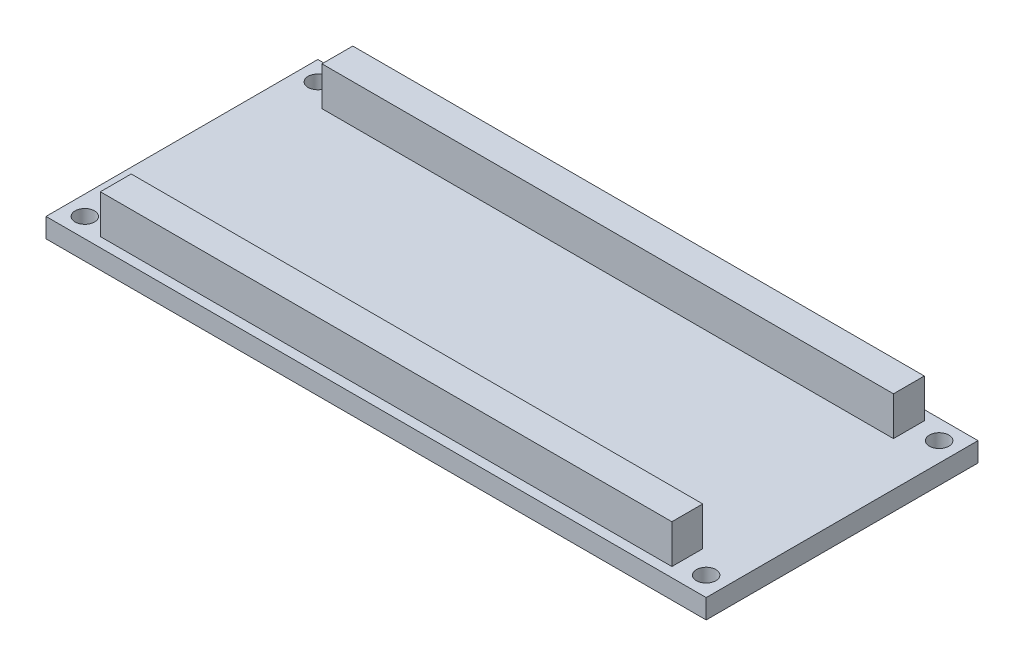
ISO-10303-21;
HEADER;
FILE_DESCRIPTION(('STEP AP214'),'2;1');
FILE_NAME('part.step','',(''),(''),'','','');
FILE_SCHEMA(('AUTOMOTIVE_DESIGN { 1 0 10303 214 1 1 1 1 }'));
ENDSEC;
DATA;
#1=APPLICATION_CONTEXT('core data for automotive mechanical design processes');
#2=APPLICATION_PROTOCOL_DEFINITION('international standard','automotive_design',2000,#1);
#3=PRODUCT_CONTEXT('',#1,'mechanical');
#4=PRODUCT('Part','Part','',(#3));
#5=PRODUCT_RELATED_PRODUCT_CATEGORY('part','',(#4));
#6=PRODUCT_DEFINITION_FORMATION('','',#4);
#7=PRODUCT_DEFINITION_CONTEXT('part definition',#1,'design');
#8=PRODUCT_DEFINITION('design','',#6,#7);
#9=PRODUCT_DEFINITION_SHAPE('','',#8);
#10=(LENGTH_UNIT() NAMED_UNIT(*) SI_UNIT(.MILLI.,.METRE.));
#11=(NAMED_UNIT(*) PLANE_ANGLE_UNIT() SI_UNIT($,.RADIAN.));
#12=(NAMED_UNIT(*) SI_UNIT($,.STERADIAN.) SOLID_ANGLE_UNIT());
#13=UNCERTAINTY_MEASURE_WITH_UNIT(LENGTH_MEASURE(1.E-05),#10,'distance_accuracy_value','');
#14=(GEOMETRIC_REPRESENTATION_CONTEXT(3) GLOBAL_UNCERTAINTY_ASSIGNED_CONTEXT((#13)) GLOBAL_UNIT_ASSIGNED_CONTEXT((#10,
#11,#12)) REPRESENTATION_CONTEXT('',''));
#15=CARTESIAN_POINT('',(0.,0.,0.));
#16=DIRECTION('',(0.,0.,1.));
#17=DIRECTION('',(1.,0.,0.));
#18=AXIS2_PLACEMENT_3D('',#15,#16,#17);
#19=CARTESIAN_POINT('',(0.,1.27,0.));
#20=DIRECTION('',(0.,-1.,0.));
#21=DIRECTION('',(0.,0.,-1.));
#22=AXIS2_PLACEMENT_3D('',#19,#20,#21);
#23=PLANE('',#22);
#24=DIRECTION('',(-1.,0.,0.));
#25=VECTOR('',#24,1.);
#26=CARTESIAN_POINT('',(-18.6685887958765,1.27,-6.23826268746161));
#27=LINE('',#26,#25);
#28=CARTESIAN_POINT('',(18.7125148871609,1.27,-6.23826268746161));
#29=VERTEX_POINT('',#28);
#30=CARTESIAN_POINT('',(-18.6685887958765,1.27,-6.23826268746161));
#31=VERTEX_POINT('',#30);
#32=EDGE_CURVE('E170',#29,#31,#27,.T.);
#33=ORIENTED_EDGE('',*,*,#32,.T.);
#34=DIRECTION('',(0.,0.,-1.));
#35=VECTOR('',#34,1.);
#36=CARTESIAN_POINT('',(-18.6685887958765,1.27,-8.255));
#37=LINE('',#36,#35);
#38=CARTESIAN_POINT('',(-18.6685887958765,1.27,-8.255));
#39=VERTEX_POINT('',#38);
#40=EDGE_CURVE('E144',#31,#39,#37,.T.);
#41=ORIENTED_EDGE('',*,*,#40,.T.);
#42=DIRECTION('',(1.,0.,0.));
#43=VECTOR('',#42,1.);
#44=CARTESIAN_POINT('',(-18.6685887958765,1.27,-8.255));
#45=LINE('',#44,#43);
#46=CARTESIAN_POINT('',(18.7125148871609,1.27,-8.255));
#47=VERTEX_POINT('',#46);
#48=EDGE_CURVE('E160',#39,#47,#45,.T.);
#49=ORIENTED_EDGE('',*,*,#48,.T.);
#50=DIRECTION('',(0.,0.,1.));
#51=VECTOR('',#50,1.);
#52=CARTESIAN_POINT('',(18.7125148871609,1.27,-8.255));
#53=LINE('',#52,#51);
#54=EDGE_CURVE('E64',#47,#29,#53,.T.);
#55=ORIENTED_EDGE('',*,*,#54,.T.);
#56=EDGE_LOOP('',(#33,#41,#49,#55));
#57=FACE_BOUND('',#56,.T.);
#58=DIRECTION('',(0.,0.,-1.));
#59=VECTOR('',#58,1.);
#60=CARTESIAN_POINT('',(21.59,1.27,8.89));
#61=LINE('',#60,#59);
#62=CARTESIAN_POINT('',(21.59,1.27,8.89));
#63=VERTEX_POINT('',#62);
#64=CARTESIAN_POINT('',(21.59,1.27,-8.89));
#65=VERTEX_POINT('',#64);
#66=EDGE_CURVE('E233',#63,#65,#61,.T.);
#67=ORIENTED_EDGE('',*,*,#66,.T.);
#68=DIRECTION('',(-1.,0.,0.));
#69=VECTOR('',#68,1.);
#70=CARTESIAN_POINT('',(-21.59,1.27,-8.89));
#71=LINE('',#70,#69);
#72=CARTESIAN_POINT('',(-21.59,1.27,-8.89));
#73=VERTEX_POINT('',#72);
#74=EDGE_CURVE('E236',#65,#73,#71,.T.);
#75=ORIENTED_EDGE('',*,*,#74,.T.);
#76=DIRECTION('',(0.,0.,1.));
#77=VECTOR('',#76,1.);
#78=CARTESIAN_POINT('',(-21.59,1.27,8.89));
#79=LINE('',#78,#77);
#80=CARTESIAN_POINT('',(-21.59,1.27,8.89));
#81=VERTEX_POINT('',#80);
#82=EDGE_CURVE('E239',#73,#81,#79,.T.);
#83=ORIENTED_EDGE('',*,*,#82,.T.);
#84=DIRECTION('',(1.,0.,0.));
#85=VECTOR('',#84,1.);
#86=CARTESIAN_POINT('',(-21.59,1.27,8.89));
#87=LINE('',#86,#85);
#88=EDGE_CURVE('E241',#81,#63,#87,.T.);
#89=ORIENTED_EDGE('',*,*,#88,.T.);
#90=EDGE_LOOP('',(#67,#75,#83,#89));
#91=FACE_BOUND('',#90,.T.);
#92=CARTESIAN_POINT('',(-20.32,1.27,-7.62));
#93=DIRECTION('',(0.,-1.,0.));
#94=DIRECTION('',(0.,0.,-1.));
#95=AXIS2_PLACEMENT_3D('',#92,#93,#94);
#96=CIRCLE('',#95,0.634999999999999);
#97=CARTESIAN_POINT('',(-20.32,1.27,-8.255));
#98=VERTEX_POINT('',#97);
#99=EDGE_CURVE('E229',#98,#98,#96,.T.);
#100=ORIENTED_EDGE('',*,*,#99,.T.);
#101=EDGE_LOOP('',(#100));
#102=FACE_BOUND('',#101,.T.);
#103=CARTESIAN_POINT('',(-20.32,1.27,7.62));
#104=DIRECTION('',(0.,-1.,0.));
#105=DIRECTION('',(0.,0.,-1.));
#106=AXIS2_PLACEMENT_3D('',#103,#104,#105);
#107=CIRCLE('',#106,0.634999999999999);
#108=CARTESIAN_POINT('',(-20.32,1.27,6.985));
#109=VERTEX_POINT('',#108);
#110=EDGE_CURVE('E223',#109,#109,#107,.F.);
#111=ORIENTED_EDGE('',*,*,#110,.F.);
#112=EDGE_LOOP('',(#111));
#113=FACE_BOUND('',#112,.T.);
#114=CARTESIAN_POINT('',(20.32,1.27,-7.62));
#115=DIRECTION('',(0.,-1.,0.));
#116=DIRECTION('',(0.,0.,-1.));
#117=AXIS2_PLACEMENT_3D('',#114,#115,#116);
#118=CIRCLE('',#117,0.634999999999999);
#119=CARTESIAN_POINT('',(20.32,1.27,-8.255));
#120=VERTEX_POINT('',#119);
#121=EDGE_CURVE('E217',#120,#120,#118,.F.);
#122=ORIENTED_EDGE('',*,*,#121,.F.);
#123=EDGE_LOOP('',(#122));
#124=FACE_BOUND('',#123,.T.);
#125=CARTESIAN_POINT('',(20.32,1.27,7.62));
#126=DIRECTION('',(0.,-1.,0.));
#127=DIRECTION('',(0.,0.,-1.));
#128=AXIS2_PLACEMENT_3D('',#125,#126,#127);
#129=CIRCLE('',#128,0.634999999999999);
#130=CARTESIAN_POINT('',(20.32,1.27,6.985));
#131=VERTEX_POINT('',#130);
#132=EDGE_CURVE('E211',#131,#131,#129,.T.);
#133=ORIENTED_EDGE('',*,*,#132,.T.);
#134=EDGE_LOOP('',(#133));
#135=FACE_BOUND('',#134,.T.);
#136=DIRECTION('',(0.,0.,1.));
#137=VECTOR('',#136,1.);
#138=CARTESIAN_POINT('',(-18.6685887958765,1.27,8.255));
#139=LINE('',#138,#137);
#140=CARTESIAN_POINT('',(-18.6685887958765,1.27,6.23826268746161));
#141=VERTEX_POINT('',#140);
#142=CARTESIAN_POINT('',(-18.6685887958765,1.27,8.255));
#143=VERTEX_POINT('',#142);
#144=EDGE_CURVE('E149',#141,#143,#139,.T.);
#145=ORIENTED_EDGE('',*,*,#144,.F.);
#146=DIRECTION('',(-1.,0.,0.));
#147=VECTOR('',#146,1.);
#148=CARTESIAN_POINT('',(-18.6685887958765,1.27,6.23826268746161));
#149=LINE('',#148,#147);
#150=CARTESIAN_POINT('',(18.7125148871609,1.27,6.23826268746161));
#151=VERTEX_POINT('',#150);
#152=EDGE_CURVE('E183',#151,#141,#149,.T.);
#153=ORIENTED_EDGE('',*,*,#152,.F.);
#154=DIRECTION('',(0.,0.,-1.));
#155=VECTOR('',#154,1.);
#156=CARTESIAN_POINT('',(18.7125148871609,1.27,8.255));
#157=LINE('',#156,#155);
#158=CARTESIAN_POINT('',(18.7125148871609,1.27,8.255));
#159=VERTEX_POINT('',#158);
#160=EDGE_CURVE('E193',#159,#151,#157,.T.);
#161=ORIENTED_EDGE('',*,*,#160,.F.);
#162=DIRECTION('',(1.,0.,0.));
#163=VECTOR('',#162,1.);
#164=CARTESIAN_POINT('',(-18.6685887958765,1.27,8.255));
#165=LINE('',#164,#163);
#166=EDGE_CURVE('E72',#143,#159,#165,.T.);
#167=ORIENTED_EDGE('',*,*,#166,.F.);
#168=EDGE_LOOP('',(#145,#153,#161,#167));
#169=FACE_BOUND('',#168,.T.);
#170=ADVANCED_FACE('F49',(#57,#91,#102,#113,#124,#135,#169),#23,.F.);
#171=CARTESIAN_POINT('',(21.59,1.27,8.89));
#172=DIRECTION('',(-1.,0.,0.));
#173=DIRECTION('',(0.,0.,1.));
#174=AXIS2_PLACEMENT_3D('',#171,#172,#173);
#175=PLANE('',#174);
#176=DIRECTION('',(0.,0.,-1.));
#177=VECTOR('',#176,1.);
#178=CARTESIAN_POINT('',(21.59,0.,8.89));
#179=LINE('',#178,#177);
#180=CARTESIAN_POINT('',(21.59,0.,8.89));
#181=VERTEX_POINT('',#180);
#182=CARTESIAN_POINT('',(21.59,0.,-8.89));
#183=VERTEX_POINT('',#182);
#184=EDGE_CURVE('E232',#181,#183,#179,.T.);
#185=ORIENTED_EDGE('',*,*,#184,.T.);
#186=DIRECTION('',(0.,-1.,0.));
#187=VECTOR('',#186,1.);
#188=CARTESIAN_POINT('',(21.59,1.27,-8.89));
#189=LINE('',#188,#187);
#190=EDGE_CURVE('E11',#65,#183,#189,.T.);
#191=ORIENTED_EDGE('',*,*,#190,.F.);
#192=ORIENTED_EDGE('',*,*,#66,.F.);
#193=DIRECTION('',(0.,-1.,0.));
#194=VECTOR('',#193,1.);
#195=CARTESIAN_POINT('',(21.59,1.27,8.89));
#196=LINE('',#195,#194);
#197=EDGE_CURVE('E243',#63,#181,#196,.T.);
#198=ORIENTED_EDGE('',*,*,#197,.T.);
#199=EDGE_LOOP('',(#185,#191,#192,#198));
#200=FACE_BOUND('',#199,.T.);
#201=ADVANCED_FACE('F51',(#200),#175,.F.);
#202=CARTESIAN_POINT('',(-21.59,1.27,-8.89));
#203=DIRECTION('',(0.,0.,1.));
#204=DIRECTION('',(1.,0.,0.));
#205=AXIS2_PLACEMENT_3D('',#202,#203,#204);
#206=PLANE('',#205);
#207=DIRECTION('',(-1.,0.,0.));
#208=VECTOR('',#207,1.);
#209=CARTESIAN_POINT('',(-21.59,0.,-8.89));
#210=LINE('',#209,#208);
#211=CARTESIAN_POINT('',(-21.59,0.,-8.89));
#212=VERTEX_POINT('',#211);
#213=EDGE_CURVE('E246',#183,#212,#210,.T.);
#214=ORIENTED_EDGE('',*,*,#213,.T.);
#215=DIRECTION('',(0.,-1.,0.));
#216=VECTOR('',#215,1.);
#217=CARTESIAN_POINT('',(-21.59,1.27,-8.89));
#218=LINE('',#217,#216);
#219=EDGE_CURVE('E57',#73,#212,#218,.T.);
#220=ORIENTED_EDGE('',*,*,#219,.F.);
#221=ORIENTED_EDGE('',*,*,#74,.F.);
#222=ORIENTED_EDGE('',*,*,#190,.T.);
#223=EDGE_LOOP('',(#214,#220,#221,#222));
#224=FACE_BOUND('',#223,.T.);
#225=ADVANCED_FACE('F276',(#224),#206,.F.);
#226=CARTESIAN_POINT('',(-21.59,1.27,8.89));
#227=DIRECTION('',(1.,0.,0.));
#228=DIRECTION('',(0.,0.,-1.));
#229=AXIS2_PLACEMENT_3D('',#226,#227,#228);
#230=PLANE('',#229);
#231=DIRECTION('',(0.,0.,1.));
#232=VECTOR('',#231,1.);
#233=CARTESIAN_POINT('',(-21.59,0.,8.89));
#234=LINE('',#233,#232);
#235=CARTESIAN_POINT('',(-21.59,0.,8.89));
#236=VERTEX_POINT('',#235);
#237=EDGE_CURVE('E248',#212,#236,#234,.T.);
#238=ORIENTED_EDGE('',*,*,#237,.T.);
#239=DIRECTION('',(0.,-1.,0.));
#240=VECTOR('',#239,1.);
#241=CARTESIAN_POINT('',(-21.59,1.27,8.89));
#242=LINE('',#241,#240);
#243=EDGE_CURVE('E253',#81,#236,#242,.T.);
#244=ORIENTED_EDGE('',*,*,#243,.F.);
#245=ORIENTED_EDGE('',*,*,#82,.F.);
#246=ORIENTED_EDGE('',*,*,#219,.T.);
#247=EDGE_LOOP('',(#238,#244,#245,#246));
#248=FACE_BOUND('',#247,.T.);
#249=ADVANCED_FACE('F260',(#248),#230,.F.);
#250=CARTESIAN_POINT('',(-21.59,1.27,8.89));
#251=DIRECTION('',(0.,0.,-1.));
#252=DIRECTION('',(-1.,0.,0.));
#253=AXIS2_PLACEMENT_3D('',#250,#251,#252);
#254=PLANE('',#253);
#255=DIRECTION('',(1.,0.,0.));
#256=VECTOR('',#255,1.);
#257=CARTESIAN_POINT('',(-21.59,0.,8.89));
#258=LINE('',#257,#256);
#259=EDGE_CURVE('E237',#236,#181,#258,.T.);
#260=ORIENTED_EDGE('',*,*,#259,.T.);
#261=ORIENTED_EDGE('',*,*,#197,.F.);
#262=ORIENTED_EDGE('',*,*,#88,.F.);
#263=ORIENTED_EDGE('',*,*,#243,.T.);
#264=EDGE_LOOP('',(#260,#261,#262,#263));
#265=FACE_BOUND('',#264,.T.);
#266=ADVANCED_FACE('F269',(#265),#254,.F.);
#267=CARTESIAN_POINT('',(0.,0.,0.));
#268=DIRECTION('',(0.,-1.,0.));
#269=DIRECTION('',(0.,0.,-1.));
#270=AXIS2_PLACEMENT_3D('',#267,#268,#269);
#271=PLANE('',#270);
#272=CARTESIAN_POINT('',(20.32,0.,7.62));
#273=DIRECTION('',(0.,1.,0.));
#274=DIRECTION('',(0.,0.,-1.));
#275=AXIS2_PLACEMENT_3D('',#272,#273,#274);
#276=CIRCLE('',#275,0.634999999999999);
#277=CARTESIAN_POINT('',(20.32,0.,6.985));
#278=VERTEX_POINT('',#277);
#279=EDGE_CURVE('E208',#278,#278,#276,.T.);
#280=ORIENTED_EDGE('',*,*,#279,.T.);
#281=EDGE_LOOP('',(#280));
#282=FACE_BOUND('',#281,.T.);
#283=CARTESIAN_POINT('',(20.32,0.,-7.62));
#284=DIRECTION('',(0.,-1.,0.));
#285=DIRECTION('',(0.,0.,1.));
#286=AXIS2_PLACEMENT_3D('',#283,#284,#285);
#287=CIRCLE('',#286,0.634999999999999);
#288=CARTESIAN_POINT('',(20.32,0.,-6.985));
#289=VERTEX_POINT('',#288);
#290=EDGE_CURVE('E214',#289,#289,#287,.T.);
#291=ORIENTED_EDGE('',*,*,#290,.F.);
#292=EDGE_LOOP('',(#291));
#293=FACE_BOUND('',#292,.T.);
#294=CARTESIAN_POINT('',(-20.32,0.,7.62));
#295=DIRECTION('',(0.,-1.,0.));
#296=DIRECTION('',(0.,0.,-1.));
#297=AXIS2_PLACEMENT_3D('',#294,#295,#296);
#298=CIRCLE('',#297,0.634999999999999);
#299=CARTESIAN_POINT('',(-20.32,0.,6.985));
#300=VERTEX_POINT('',#299);
#301=EDGE_CURVE('E220',#300,#300,#298,.T.);
#302=ORIENTED_EDGE('',*,*,#301,.F.);
#303=EDGE_LOOP('',(#302));
#304=FACE_BOUND('',#303,.T.);
#305=CARTESIAN_POINT('',(-20.32,0.,-7.62));
#306=DIRECTION('',(0.,1.,0.));
#307=DIRECTION('',(0.,0.,1.));
#308=AXIS2_PLACEMENT_3D('',#305,#306,#307);
#309=CIRCLE('',#308,0.634999999999999);
#310=CARTESIAN_POINT('',(-20.32,0.,-6.985));
#311=VERTEX_POINT('',#310);
#312=EDGE_CURVE('E226',#311,#311,#309,.T.);
#313=ORIENTED_EDGE('',*,*,#312,.T.);
#314=EDGE_LOOP('',(#313));
#315=FACE_BOUND('',#314,.T.);
#316=ORIENTED_EDGE('',*,*,#184,.F.);
#317=ORIENTED_EDGE('',*,*,#259,.F.);
#318=ORIENTED_EDGE('',*,*,#237,.F.);
#319=ORIENTED_EDGE('',*,*,#213,.F.);
#320=EDGE_LOOP('',(#316,#317,#318,#319));
#321=FACE_BOUND('',#320,.T.);
#322=ADVANCED_FACE('F266',(#282,#293,#304,#315,#321),#271,.T.);
#323=CARTESIAN_POINT('',(-20.32,0.,-7.62));
#324=DIRECTION('',(0.,1.,0.));
#325=DIRECTION('',(0.,0.,1.));
#326=AXIS2_PLACEMENT_3D('',#323,#324,#325);
#327=CYLINDRICAL_SURFACE('',#326,0.634999999999999);
#328=ORIENTED_EDGE('',*,*,#312,.F.);
#329=EDGE_LOOP('',(#328));
#330=FACE_BOUND('',#329,.T.);
#331=ORIENTED_EDGE('',*,*,#99,.F.);
#332=EDGE_LOOP('',(#331));
#333=FACE_BOUND('',#332,.T.);
#334=ADVANCED_FACE('F290',(#330,#333),#327,.F.);
#335=CARTESIAN_POINT('',(-20.32,0.,7.62));
#336=DIRECTION('',(0.,1.,0.));
#337=DIRECTION('',(0.,0.,1.));
#338=AXIS2_PLACEMENT_3D('',#335,#336,#337);
#339=CYLINDRICAL_SURFACE('',#338,0.634999999999999);
#340=ORIENTED_EDGE('',*,*,#301,.T.);
#341=EDGE_LOOP('',(#340));
#342=FACE_BOUND('',#341,.T.);
#343=ORIENTED_EDGE('',*,*,#110,.T.);
#344=EDGE_LOOP('',(#343));
#345=FACE_BOUND('',#344,.T.);
#346=ADVANCED_FACE('F450',(#342,#345),#339,.F.);
#347=CARTESIAN_POINT('',(20.32,0.,-7.62));
#348=DIRECTION('',(0.,1.,0.));
#349=DIRECTION('',(0.,0.,1.));
#350=AXIS2_PLACEMENT_3D('',#347,#348,#349);
#351=CYLINDRICAL_SURFACE('',#350,0.634999999999999);
#352=ORIENTED_EDGE('',*,*,#290,.T.);
#353=EDGE_LOOP('',(#352));
#354=FACE_BOUND('',#353,.T.);
#355=ORIENTED_EDGE('',*,*,#121,.T.);
#356=EDGE_LOOP('',(#355));
#357=FACE_BOUND('',#356,.T.);
#358=ADVANCED_FACE('F442',(#354,#357),#351,.F.);
#359=CARTESIAN_POINT('',(20.32,0.,7.62));
#360=DIRECTION('',(0.,1.,0.));
#361=DIRECTION('',(0.,0.,1.));
#362=AXIS2_PLACEMENT_3D('',#359,#360,#361);
#363=CYLINDRICAL_SURFACE('',#362,0.634999999999999);
#364=ORIENTED_EDGE('',*,*,#279,.F.);
#365=EDGE_LOOP('',(#364));
#366=FACE_BOUND('',#365,.T.);
#367=ORIENTED_EDGE('',*,*,#132,.F.);
#368=EDGE_LOOP('',(#367));
#369=FACE_BOUND('',#368,.T.);
#370=ADVANCED_FACE('F312',(#366,#369),#363,.F.);
#371=CARTESIAN_POINT('',(-18.6685887958765,3.81,8.255));
#372=DIRECTION('',(1.,0.,0.));
#373=DIRECTION('',(0.,0.,-1.));
#374=AXIS2_PLACEMENT_3D('',#371,#372,#373);
#375=PLANE('',#374);
#376=ORIENTED_EDGE('',*,*,#144,.T.);
#377=DIRECTION('',(0.,-1.,0.));
#378=VECTOR('',#377,1.);
#379=CARTESIAN_POINT('',(-18.6685887958765,3.81,8.255));
#380=LINE('',#379,#378);
#381=CARTESIAN_POINT('',(-18.6685887958765,3.81,8.255));
#382=VERTEX_POINT('',#381);
#383=EDGE_CURVE('E206',#382,#143,#380,.T.);
#384=ORIENTED_EDGE('',*,*,#383,.F.);
#385=DIRECTION('',(0.,0.,1.));
#386=VECTOR('',#385,1.);
#387=CARTESIAN_POINT('',(-18.6685887958765,3.81,8.255));
#388=LINE('',#387,#386);
#389=CARTESIAN_POINT('',(-18.6685887958765,3.81,6.23826268746161));
#390=VERTEX_POINT('',#389);
#391=EDGE_CURVE('E179',#390,#382,#388,.T.);
#392=ORIENTED_EDGE('',*,*,#391,.F.);
#393=DIRECTION('',(0.,-1.,0.));
#394=VECTOR('',#393,1.);
#395=CARTESIAN_POINT('',(-18.6685887958765,3.81,6.23826268746161));
#396=LINE('',#395,#394);
#397=EDGE_CURVE('E189',#390,#141,#396,.T.);
#398=ORIENTED_EDGE('',*,*,#397,.T.);
#399=EDGE_LOOP('',(#376,#384,#392,#398));
#400=FACE_BOUND('',#399,.T.);
#401=ADVANCED_FACE('F308',(#400),#375,.F.);
#402=CARTESIAN_POINT('',(-18.6685887958765,3.81,8.255));
#403=DIRECTION('',(0.,0.,-1.));
#404=DIRECTION('',(-1.,0.,0.));
#405=AXIS2_PLACEMENT_3D('',#402,#403,#404);
#406=PLANE('',#405);
#407=ORIENTED_EDGE('',*,*,#166,.T.);
#408=DIRECTION('',(0.,-1.,0.));
#409=VECTOR('',#408,1.);
#410=CARTESIAN_POINT('',(18.7125148871609,3.81,8.255));
#411=LINE('',#410,#409);
#412=CARTESIAN_POINT('',(18.7125148871609,3.81,8.255));
#413=VERTEX_POINT('',#412);
#414=EDGE_CURVE('E203',#413,#159,#411,.T.);
#415=ORIENTED_EDGE('',*,*,#414,.F.);
#416=DIRECTION('',(1.,0.,0.));
#417=VECTOR('',#416,1.);
#418=CARTESIAN_POINT('',(-18.6685887958765,3.81,8.255));
#419=LINE('',#418,#417);
#420=EDGE_CURVE('E182',#382,#413,#419,.T.);
#421=ORIENTED_EDGE('',*,*,#420,.F.);
#422=ORIENTED_EDGE('',*,*,#383,.T.);
#423=EDGE_LOOP('',(#407,#415,#421,#422));
#424=FACE_BOUND('',#423,.T.);
#425=ADVANCED_FACE('F311',(#424),#406,.F.);
#426=CARTESIAN_POINT('',(18.7125148871609,3.81,8.255));
#427=DIRECTION('',(-1.,0.,0.));
#428=DIRECTION('',(0.,0.,1.));
#429=AXIS2_PLACEMENT_3D('',#426,#427,#428);
#430=PLANE('',#429);
#431=ORIENTED_EDGE('',*,*,#160,.T.);
#432=DIRECTION('',(0.,-1.,0.));
#433=VECTOR('',#432,1.);
#434=CARTESIAN_POINT('',(18.7125148871609,3.81,6.23826268746161));
#435=LINE('',#434,#433);
#436=CARTESIAN_POINT('',(18.7125148871609,3.81,6.23826268746161));
#437=VERTEX_POINT('',#436);
#438=EDGE_CURVE('E200',#437,#151,#435,.T.);
#439=ORIENTED_EDGE('',*,*,#438,.F.);
#440=DIRECTION('',(0.,0.,-1.));
#441=VECTOR('',#440,1.);
#442=CARTESIAN_POINT('',(18.7125148871609,3.81,8.255));
#443=LINE('',#442,#441);
#444=EDGE_CURVE('E185',#413,#437,#443,.T.);
#445=ORIENTED_EDGE('',*,*,#444,.F.);
#446=ORIENTED_EDGE('',*,*,#414,.T.);
#447=EDGE_LOOP('',(#431,#439,#445,#446));
#448=FACE_BOUND('',#447,.T.);
#449=ADVANCED_FACE('F320',(#448),#430,.F.);
#450=CARTESIAN_POINT('',(-18.6685887958765,3.81,6.23826268746161));
#451=DIRECTION('',(0.,0.,1.));
#452=DIRECTION('',(1.,0.,0.));
#453=AXIS2_PLACEMENT_3D('',#450,#451,#452);
#454=PLANE('',#453);
#455=ORIENTED_EDGE('',*,*,#152,.T.);
#456=ORIENTED_EDGE('',*,*,#397,.F.);
#457=DIRECTION('',(-1.,0.,0.));
#458=VECTOR('',#457,1.);
#459=CARTESIAN_POINT('',(-18.6685887958765,3.81,6.23826268746161));
#460=LINE('',#459,#458);
#461=EDGE_CURVE('E187',#437,#390,#460,.T.);
#462=ORIENTED_EDGE('',*,*,#461,.F.);
#463=ORIENTED_EDGE('',*,*,#438,.T.);
#464=EDGE_LOOP('',(#455,#456,#462,#463));
#465=FACE_BOUND('',#464,.T.);
#466=ADVANCED_FACE('F328',(#465),#454,.F.);
#467=CARTESIAN_POINT('',(0.,3.81,0.));
#468=DIRECTION('',(0.,-1.,0.));
#469=DIRECTION('',(0.,0.,-1.));
#470=AXIS2_PLACEMENT_3D('',#467,#468,#469);
#471=PLANE('',#470);
#472=ORIENTED_EDGE('',*,*,#391,.T.);
#473=ORIENTED_EDGE('',*,*,#420,.T.);
#474=ORIENTED_EDGE('',*,*,#444,.T.);
#475=ORIENTED_EDGE('',*,*,#461,.T.);
#476=EDGE_LOOP('',(#472,#473,#474,#475));
#477=FACE_BOUND('',#476,.T.);
#478=ADVANCED_FACE('F336',(#477),#471,.F.);
#479=CARTESIAN_POINT('',(-18.6685887958765,3.81,-8.255));
#480=DIRECTION('',(-1.,0.,0.));
#481=DIRECTION('',(0.,0.,1.));
#482=AXIS2_PLACEMENT_3D('',#479,#480,#481);
#483=PLANE('',#482);
#484=ORIENTED_EDGE('',*,*,#40,.F.);
#485=DIRECTION('',(0.,-1.,0.));
#486=VECTOR('',#485,1.);
#487=CARTESIAN_POINT('',(-18.6685887958765,3.81,-6.23826268746161));
#488=LINE('',#487,#486);
#489=CARTESIAN_POINT('',(-18.6685887958765,3.81,-6.23826268746161));
#490=VERTEX_POINT('',#489);
#491=EDGE_CURVE('E138',#490,#31,#488,.T.);
#492=ORIENTED_EDGE('',*,*,#491,.F.);
#493=DIRECTION('',(0.,0.,-1.));
#494=VECTOR('',#493,1.);
#495=CARTESIAN_POINT('',(-18.6685887958765,3.81,-8.255));
#496=LINE('',#495,#494);
#497=CARTESIAN_POINT('',(-18.6685887958765,3.81,-8.255));
#498=VERTEX_POINT('',#497);
#499=EDGE_CURVE('E141',#490,#498,#496,.T.);
#500=ORIENTED_EDGE('',*,*,#499,.T.);
#501=DIRECTION('',(0.,-1.,0.));
#502=VECTOR('',#501,1.);
#503=CARTESIAN_POINT('',(-18.6685887958765,3.81,-8.255));
#504=LINE('',#503,#502);
#505=EDGE_CURVE('E168',#498,#39,#504,.T.);
#506=ORIENTED_EDGE('',*,*,#505,.T.);
#507=EDGE_LOOP('',(#484,#492,#500,#506));
#508=FACE_BOUND('',#507,.T.);
#509=ADVANCED_FACE('F140',(#508),#483,.T.);
#510=CARTESIAN_POINT('',(-18.6685887958765,3.81,-6.23826268746161));
#511=DIRECTION('',(0.,0.,1.));
#512=DIRECTION('',(1.,0.,0.));
#513=AXIS2_PLACEMENT_3D('',#510,#511,#512);
#514=PLANE('',#513);
#515=ORIENTED_EDGE('',*,*,#32,.F.);
#516=DIRECTION('',(0.,-1.,0.));
#517=VECTOR('',#516,1.);
#518=CARTESIAN_POINT('',(18.7125148871609,3.81,-6.23826268746161));
#519=LINE('',#518,#517);
#520=CARTESIAN_POINT('',(18.7125148871609,3.81,-6.23826268746161));
#521=VERTEX_POINT('',#520);
#522=EDGE_CURVE('E150',#521,#29,#519,.T.);
#523=ORIENTED_EDGE('',*,*,#522,.F.);
#524=DIRECTION('',(-1.,0.,0.));
#525=VECTOR('',#524,1.);
#526=CARTESIAN_POINT('',(-18.6685887958765,3.81,-6.23826268746161));
#527=LINE('',#526,#525);
#528=EDGE_CURVE('E156',#521,#490,#527,.T.);
#529=ORIENTED_EDGE('',*,*,#528,.T.);
#530=ORIENTED_EDGE('',*,*,#491,.T.);
#531=EDGE_LOOP('',(#515,#523,#529,#530));
#532=FACE_BOUND('',#531,.T.);
#533=ADVANCED_FACE('F162',(#532),#514,.T.);
#534=CARTESIAN_POINT('',(18.7125148871609,3.81,-8.255));
#535=DIRECTION('',(1.,0.,0.));
#536=DIRECTION('',(0.,0.,-1.));
#537=AXIS2_PLACEMENT_3D('',#534,#535,#536);
#538=PLANE('',#537);
#539=ORIENTED_EDGE('',*,*,#54,.F.);
#540=DIRECTION('',(0.,-1.,0.));
#541=VECTOR('',#540,1.);
#542=CARTESIAN_POINT('',(18.7125148871609,3.81,-8.255));
#543=LINE('',#542,#541);
#544=CARTESIAN_POINT('',(18.7125148871609,3.81,-8.255));
#545=VERTEX_POINT('',#544);
#546=EDGE_CURVE('E176',#545,#47,#543,.T.);
#547=ORIENTED_EDGE('',*,*,#546,.F.);
#548=DIRECTION('',(0.,0.,1.));
#549=VECTOR('',#548,1.);
#550=CARTESIAN_POINT('',(18.7125148871609,3.81,-8.255));
#551=LINE('',#550,#549);
#552=EDGE_CURVE('E163',#545,#521,#551,.T.);
#553=ORIENTED_EDGE('',*,*,#552,.T.);
#554=ORIENTED_EDGE('',*,*,#522,.T.);
#555=EDGE_LOOP('',(#539,#547,#553,#554));
#556=FACE_BOUND('',#555,.T.);
#557=ADVANCED_FACE('F357',(#556),#538,.T.);
#558=CARTESIAN_POINT('',(-18.6685887958765,3.81,-8.255));
#559=DIRECTION('',(0.,0.,-1.));
#560=DIRECTION('',(-1.,0.,0.));
#561=AXIS2_PLACEMENT_3D('',#558,#559,#560);
#562=PLANE('',#561);
#563=ORIENTED_EDGE('',*,*,#48,.F.);
#564=ORIENTED_EDGE('',*,*,#505,.F.);
#565=DIRECTION('',(1.,0.,0.));
#566=VECTOR('',#565,1.);
#567=CARTESIAN_POINT('',(-18.6685887958765,3.81,-8.255));
#568=LINE('',#567,#566);
#569=EDGE_CURVE('E159',#498,#545,#568,.T.);
#570=ORIENTED_EDGE('',*,*,#569,.T.);
#571=ORIENTED_EDGE('',*,*,#546,.T.);
#572=EDGE_LOOP('',(#563,#564,#570,#571));
#573=FACE_BOUND('',#572,.T.);
#574=ADVANCED_FACE('F364',(#573),#562,.T.);
#575=CARTESIAN_POINT('',(0.,3.81,0.));
#576=DIRECTION('',(0.,-1.,0.));
#577=DIRECTION('',(0.,0.,1.));
#578=AXIS2_PLACEMENT_3D('',#575,#576,#577);
#579=PLANE('',#578);
#580=ORIENTED_EDGE('',*,*,#499,.F.);
#581=ORIENTED_EDGE('',*,*,#528,.F.);
#582=ORIENTED_EDGE('',*,*,#552,.F.);
#583=ORIENTED_EDGE('',*,*,#569,.F.);
#584=EDGE_LOOP('',(#580,#581,#582,#583));
#585=FACE_BOUND('',#584,.T.);
#586=ADVANCED_FACE('F154',(#585),#579,.F.);
#587=CLOSED_SHELL('',(#170,#201,#225,#249,#266,#322,#334,#346,#358,#370,#401,#425,#449,#466,
#478,#509,#533,#557,#574,#586));
#588=MANIFOLD_SOLID_BREP('B2',#587);
#589=ADVANCED_BREP_SHAPE_REPRESENTATION('',(#18,#588),#14);
#590=SHAPE_DEFINITION_REPRESENTATION(#9,#589);
ENDSEC;
END-ISO-10303-21;
